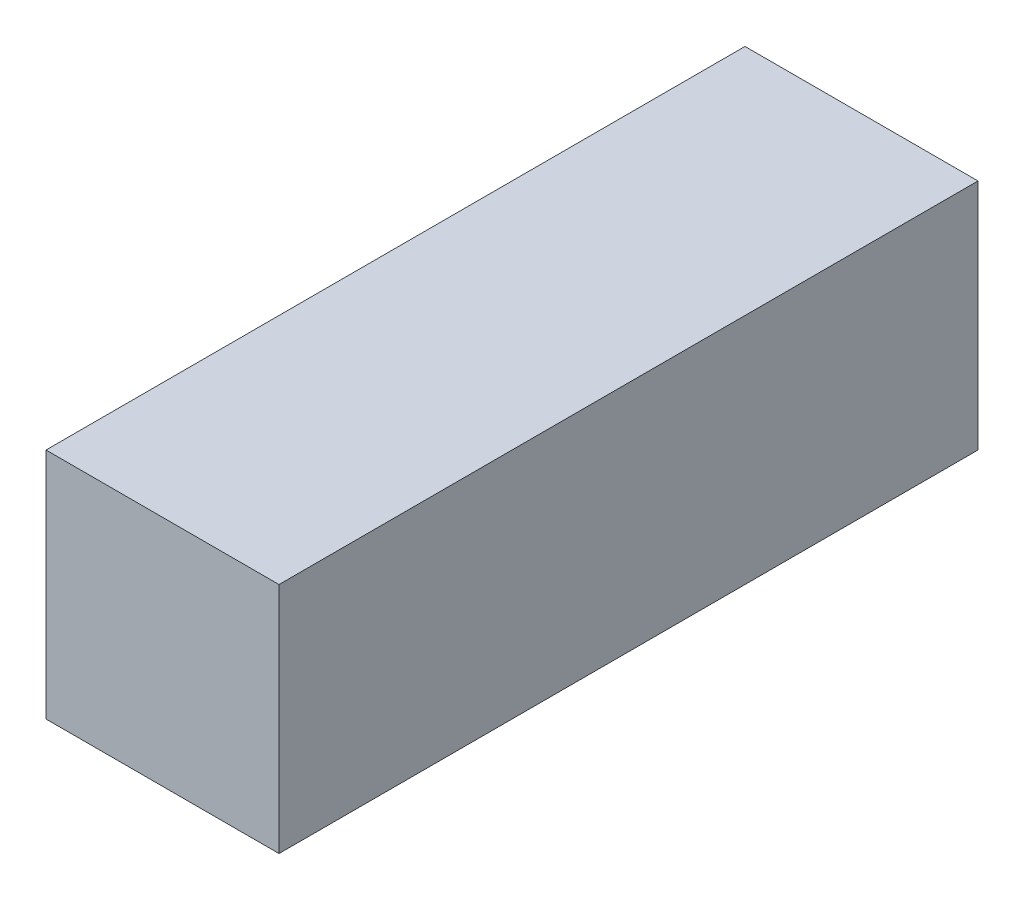
ISO-10303-21;
HEADER;
FILE_DESCRIPTION(('STEP AP214'),'2;1');
FILE_NAME('part.step','',(''),(''),'','','');
FILE_SCHEMA(('AUTOMOTIVE_DESIGN { 1 0 10303 214 1 1 1 1 }'));
ENDSEC;
DATA;
#1=APPLICATION_CONTEXT('core data for automotive mechanical design processes');
#2=APPLICATION_PROTOCOL_DEFINITION('international standard','automotive_design',2000,#1);
#3=PRODUCT_CONTEXT('',#1,'mechanical');
#4=PRODUCT('Part','Part','',(#3));
#5=PRODUCT_RELATED_PRODUCT_CATEGORY('part','',(#4));
#6=PRODUCT_DEFINITION_FORMATION('','',#4);
#7=PRODUCT_DEFINITION_CONTEXT('part definition',#1,'design');
#8=PRODUCT_DEFINITION('design','',#6,#7);
#9=PRODUCT_DEFINITION_SHAPE('','',#8);
#10=(LENGTH_UNIT() NAMED_UNIT(*) SI_UNIT(.MILLI.,.METRE.));
#11=(NAMED_UNIT(*) PLANE_ANGLE_UNIT() SI_UNIT($,.RADIAN.));
#12=(NAMED_UNIT(*) SI_UNIT($,.STERADIAN.) SOLID_ANGLE_UNIT());
#13=UNCERTAINTY_MEASURE_WITH_UNIT(LENGTH_MEASURE(1.E-05),#10,'distance_accuracy_value','');
#14=(GEOMETRIC_REPRESENTATION_CONTEXT(3) GLOBAL_UNCERTAINTY_ASSIGNED_CONTEXT((#13)) GLOBAL_UNIT_ASSIGNED_CONTEXT((#10,
#11,#12)) REPRESENTATION_CONTEXT('',''));
#15=CARTESIAN_POINT('',(0.,0.,0.));
#16=DIRECTION('',(0.,0.,1.));
#17=DIRECTION('',(1.,0.,0.));
#18=AXIS2_PLACEMENT_3D('',#15,#16,#17);
#19=CARTESIAN_POINT('',(0.,0.,60.));
#20=DIRECTION('',(1.,0.,0.));
#21=DIRECTION('',(0.,1.,0.));
#22=AXIS2_PLACEMENT_3D('',#19,#20,#21);
#23=PLANE('',#22);
#24=DIRECTION('',(0.,-1.,0.));
#25=VECTOR('',#24,1.);
#26=CARTESIAN_POINT('',(0.,0.,0.));
#27=LINE('',#26,#25);
#28=CARTESIAN_POINT('',(0.,0.,0.));
#29=VERTEX_POINT('',#28);
#30=CARTESIAN_POINT('',(0.,-20.,0.));
#31=VERTEX_POINT('',#30);
#32=EDGE_CURVE('E113',#29,#31,#27,.T.);
#33=ORIENTED_EDGE('',*,*,#32,.T.);
#34=DIRECTION('',(0.,0.,-1.));
#35=VECTOR('',#34,1.);
#36=CARTESIAN_POINT('',(0.,-20.,60.));
#37=LINE('',#36,#35);
#38=CARTESIAN_POINT('',(0.,-20.,60.));
#39=VERTEX_POINT('',#38);
#40=EDGE_CURVE('E11',#39,#31,#37,.T.);
#41=ORIENTED_EDGE('',*,*,#40,.F.);
#42=DIRECTION('',(0.,-1.,0.));
#43=VECTOR('',#42,1.);
#44=CARTESIAN_POINT('',(0.,0.,60.));
#45=LINE('',#44,#43);
#46=CARTESIAN_POINT('',(0.,0.,60.));
#47=VERTEX_POINT('',#46);
#48=EDGE_CURVE('E97',#47,#39,#45,.T.);
#49=ORIENTED_EDGE('',*,*,#48,.F.);
#50=DIRECTION('',(0.,0.,-1.));
#51=VECTOR('',#50,1.);
#52=CARTESIAN_POINT('',(0.,0.,60.));
#53=LINE('',#52,#51);
#54=EDGE_CURVE('E109',#47,#29,#53,.T.);
#55=ORIENTED_EDGE('',*,*,#54,.T.);
#56=EDGE_LOOP('',(#33,#41,#49,#55));
#57=FACE_BOUND('',#56,.T.);
#58=ADVANCED_FACE('F45',(#57),#23,.F.);
#59=CARTESIAN_POINT('',(0.,-20.,60.));
#60=DIRECTION('',(0.,1.,0.));
#61=DIRECTION('',(0.,0.,1.));
#62=AXIS2_PLACEMENT_3D('',#59,#60,#61);
#63=PLANE('',#62);
#64=CARTESIAN_POINT('',(10.,-20.,30.));
#65=DIRECTION('',(0.,-1.,0.));
#66=DIRECTION('',(0.,0.,-1.));
#67=AXIS2_PLACEMENT_3D('',#64,#65,#66);
#68=CIRCLE('',#67,2.6);
#69=CARTESIAN_POINT('',(10.,-20.,27.4));
#70=VERTEX_POINT('',#69);
#71=EDGE_CURVE('E134',#70,#70,#68,.T.);
#72=ORIENTED_EDGE('',*,*,#71,.F.);
#73=EDGE_LOOP('',(#72));
#74=FACE_BOUND('',#73,.T.);
#75=DIRECTION('',(1.,0.,0.));
#76=VECTOR('',#75,1.);
#77=CARTESIAN_POINT('',(0.,-20.,0.));
#78=LINE('',#77,#76);
#79=CARTESIAN_POINT('',(20.,-20.,0.));
#80=VERTEX_POINT('',#79);
#81=EDGE_CURVE('E102',#31,#80,#78,.T.);
#82=ORIENTED_EDGE('',*,*,#81,.T.);
#83=DIRECTION('',(0.,0.,-1.));
#84=VECTOR('',#83,1.);
#85=CARTESIAN_POINT('',(20.,-20.,60.));
#86=LINE('',#85,#84);
#87=CARTESIAN_POINT('',(20.,-20.,60.));
#88=VERTEX_POINT('',#87);
#89=EDGE_CURVE('E54',#88,#80,#86,.T.);
#90=ORIENTED_EDGE('',*,*,#89,.F.);
#91=DIRECTION('',(1.,0.,0.));
#92=VECTOR('',#91,1.);
#93=CARTESIAN_POINT('',(0.,-20.,60.));
#94=LINE('',#93,#92);
#95=EDGE_CURVE('E92',#39,#88,#94,.T.);
#96=ORIENTED_EDGE('',*,*,#95,.F.);
#97=ORIENTED_EDGE('',*,*,#40,.T.);
#98=EDGE_LOOP('',(#82,#90,#96,#97));
#99=FACE_BOUND('',#98,.T.);
#100=ADVANCED_FACE('F101',(#74,#99),#63,.F.);
#101=CARTESIAN_POINT('',(20.,0.,60.));
#102=DIRECTION('',(-1.,0.,0.));
#103=DIRECTION('',(0.,-1.,0.));
#104=AXIS2_PLACEMENT_3D('',#101,#102,#103);
#105=PLANE('',#104);
#106=DIRECTION('',(0.,1.,0.));
#107=VECTOR('',#106,1.);
#108=CARTESIAN_POINT('',(20.,0.,0.));
#109=LINE('',#108,#107);
#110=CARTESIAN_POINT('',(20.,0.,0.));
#111=VERTEX_POINT('',#110);
#112=EDGE_CURVE('E79',#80,#111,#109,.T.);
#113=ORIENTED_EDGE('',*,*,#112,.T.);
#114=DIRECTION('',(0.,0.,-1.));
#115=VECTOR('',#114,1.);
#116=CARTESIAN_POINT('',(20.,0.,60.));
#117=LINE('',#116,#115);
#118=CARTESIAN_POINT('',(20.,0.,60.));
#119=VERTEX_POINT('',#118);
#120=EDGE_CURVE('E104',#119,#111,#117,.T.);
#121=ORIENTED_EDGE('',*,*,#120,.F.);
#122=DIRECTION('',(0.,1.,0.));
#123=VECTOR('',#122,1.);
#124=CARTESIAN_POINT('',(20.,0.,60.));
#125=LINE('',#124,#123);
#126=EDGE_CURVE('E95',#88,#119,#125,.T.);
#127=ORIENTED_EDGE('',*,*,#126,.F.);
#128=ORIENTED_EDGE('',*,*,#89,.T.);
#129=EDGE_LOOP('',(#113,#121,#127,#128));
#130=FACE_BOUND('',#129,.T.);
#131=ADVANCED_FACE('F105',(#130),#105,.F.);
#132=CARTESIAN_POINT('',(0.,0.,60.));
#133=DIRECTION('',(0.,-1.,0.));
#134=DIRECTION('',(0.,0.,-1.));
#135=AXIS2_PLACEMENT_3D('',#132,#133,#134);
#136=PLANE('',#135);
#137=DIRECTION('',(-1.,0.,0.));
#138=VECTOR('',#137,1.);
#139=CARTESIAN_POINT('',(0.,0.,0.));
#140=LINE('',#139,#138);
#141=EDGE_CURVE('E85',#111,#29,#140,.T.);
#142=ORIENTED_EDGE('',*,*,#141,.T.);
#143=ORIENTED_EDGE('',*,*,#54,.F.);
#144=DIRECTION('',(-1.,0.,0.));
#145=VECTOR('',#144,1.);
#146=CARTESIAN_POINT('',(0.,0.,60.));
#147=LINE('',#146,#145);
#148=EDGE_CURVE('E62',#119,#47,#147,.T.);
#149=ORIENTED_EDGE('',*,*,#148,.F.);
#150=ORIENTED_EDGE('',*,*,#120,.T.);
#151=EDGE_LOOP('',(#142,#143,#149,#150));
#152=FACE_BOUND('',#151,.T.);
#153=ADVANCED_FACE('F127',(#152),#136,.F.);
#154=CARTESIAN_POINT('',(0.,0.,60.));
#155=DIRECTION('',(0.,0.,1.));
#156=DIRECTION('',(1.,0.,0.));
#157=AXIS2_PLACEMENT_3D('',#154,#155,#156);
#158=PLANE('',#157);
#159=ORIENTED_EDGE('',*,*,#48,.T.);
#160=ORIENTED_EDGE('',*,*,#95,.T.);
#161=ORIENTED_EDGE('',*,*,#126,.T.);
#162=ORIENTED_EDGE('',*,*,#148,.T.);
#163=EDGE_LOOP('',(#159,#160,#161,#162));
#164=FACE_BOUND('',#163,.T.);
#165=ADVANCED_FACE('F93',(#164),#158,.T.);
#166=CARTESIAN_POINT('',(0.,0.,0.));
#167=DIRECTION('',(0.,0.,1.));
#168=DIRECTION('',(1.,0.,0.));
#169=AXIS2_PLACEMENT_3D('',#166,#167,#168);
#170=PLANE('',#169);
#171=ORIENTED_EDGE('',*,*,#32,.F.);
#172=ORIENTED_EDGE('',*,*,#141,.F.);
#173=ORIENTED_EDGE('',*,*,#112,.F.);
#174=ORIENTED_EDGE('',*,*,#81,.F.);
#175=EDGE_LOOP('',(#171,#172,#173,#174));
#176=FACE_BOUND('',#175,.T.);
#177=ADVANCED_FACE('F130',(#176),#170,.F.);
#178=CARTESIAN_POINT('',(10.,-15.,30.));
#179=DIRECTION('',(0.,-1.,0.));
#180=DIRECTION('',(0.,0.,-1.));
#181=AXIS2_PLACEMENT_3D('',#178,#179,#180);
#182=CYLINDRICAL_SURFACE('',#181,2.6);
#183=CARTESIAN_POINT('',(10.,-15.,30.));
#184=DIRECTION('',(0.,-1.,0.));
#185=DIRECTION('',(0.,0.,-1.));
#186=AXIS2_PLACEMENT_3D('',#183,#184,#185);
#187=CIRCLE('',#186,2.6);
#188=CARTESIAN_POINT('',(10.,-15.,27.4));
#189=VERTEX_POINT('',#188);
#190=EDGE_CURVE('E117',#189,#189,#187,.T.);
#191=ORIENTED_EDGE('',*,*,#190,.F.);
#192=EDGE_LOOP('',(#191));
#193=FACE_BOUND('',#192,.T.);
#194=ORIENTED_EDGE('',*,*,#71,.T.);
#195=EDGE_LOOP('',(#194));
#196=FACE_BOUND('',#195,.T.);
#197=ADVANCED_FACE('F144',(#193,#196),#182,.F.);
#198=CARTESIAN_POINT('',(10.,-15.,30.));
#199=DIRECTION('',(0.,-1.,0.));
#200=DIRECTION('',(0.,0.,-1.));
#201=AXIS2_PLACEMENT_3D('',#198,#199,#200);
#202=PLANE('',#201);
#203=ORIENTED_EDGE('',*,*,#190,.T.);
#204=EDGE_LOOP('',(#203));
#205=FACE_BOUND('',#204,.T.);
#206=ADVANCED_FACE('F142',(#205),#202,.T.);
#207=CLOSED_SHELL('',(#58,#100,#131,#153,#165,#177,#197,#206));
#208=MANIFOLD_SOLID_BREP('B2',#207);
#209=ADVANCED_BREP_SHAPE_REPRESENTATION('',(#18,#208),#14);
#210=SHAPE_DEFINITION_REPRESENTATION(#9,#209);
ENDSEC;
END-ISO-10303-21;
